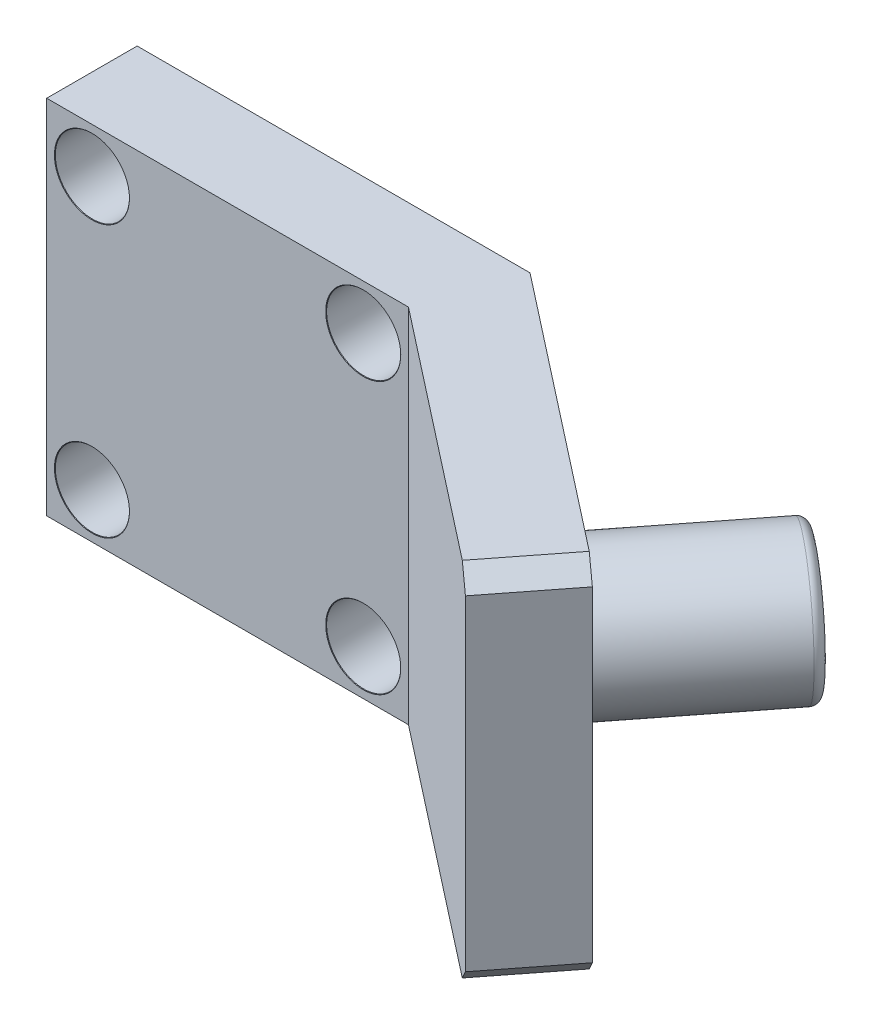
ISO-10303-21;
HEADER;
FILE_DESCRIPTION(('STEP AP214'),'2;1');
FILE_NAME('part.step','',(''),(''),'','','');
FILE_SCHEMA(('AUTOMOTIVE_DESIGN { 1 0 10303 214 1 1 1 1 }'));
ENDSEC;
DATA;
#1=APPLICATION_CONTEXT('core data for automotive mechanical design processes');
#2=APPLICATION_PROTOCOL_DEFINITION('international standard','automotive_design',2000,#1);
#3=PRODUCT_CONTEXT('',#1,'mechanical');
#4=PRODUCT('Part','Part','',(#3));
#5=PRODUCT_RELATED_PRODUCT_CATEGORY('part','',(#4));
#6=PRODUCT_DEFINITION_FORMATION('','',#4);
#7=PRODUCT_DEFINITION_CONTEXT('part definition',#1,'design');
#8=PRODUCT_DEFINITION('design','',#6,#7);
#9=PRODUCT_DEFINITION_SHAPE('','',#8);
#10=(LENGTH_UNIT() NAMED_UNIT(*) SI_UNIT(.MILLI.,.METRE.));
#11=(NAMED_UNIT(*) PLANE_ANGLE_UNIT() SI_UNIT($,.RADIAN.));
#12=(NAMED_UNIT(*) SI_UNIT($,.STERADIAN.) SOLID_ANGLE_UNIT());
#13=UNCERTAINTY_MEASURE_WITH_UNIT(LENGTH_MEASURE(1.E-05),#10,'distance_accuracy_value','');
#14=(GEOMETRIC_REPRESENTATION_CONTEXT(3) GLOBAL_UNCERTAINTY_ASSIGNED_CONTEXT((#13)) GLOBAL_UNIT_ASSIGNED_CONTEXT((#10,
#11,#12)) REPRESENTATION_CONTEXT('',''));
#15=CARTESIAN_POINT('',(0.,0.,0.));
#16=DIRECTION('',(0.,0.,1.));
#17=DIRECTION('',(1.,0.,0.));
#18=AXIS2_PLACEMENT_3D('',#15,#16,#17);
#19=CARTESIAN_POINT('',(0.,10.,0.));
#20=DIRECTION('',(-0.615661475325653,0.,0.788010753606726));
#21=DIRECTION('',(0.788010753606726,0.,0.615661475325653));
#22=AXIS2_PLACEMENT_3D('',#19,#20,#21);
#23=PLANE('',#22);
#24=CARTESIAN_POINT('',(7.88010753606726,0.,6.15661475325653));
#25=DIRECTION('',(-0.615661475325653,0.,0.788010753606726));
#26=DIRECTION('',(0.788010753606726,0.,0.615661475325653));
#27=AXIS2_PLACEMENT_3D('',#24,#25,#26);
#28=CIRCLE('',#27,3.75);
#29=CARTESIAN_POINT('',(10.8351478620925,0.,8.46534528572773));
#30=VERTEX_POINT('',#29);
#31=EDGE_CURVE('E136',#30,#30,#28,.F.);
#32=ORIENTED_EDGE('',*,*,#31,.F.);
#33=EDGE_LOOP('',(#32));
#34=FACE_BOUND('',#33,.T.);
#35=DIRECTION('',(0.,-1.,0.));
#36=VECTOR('',#35,1.);
#37=CARTESIAN_POINT('',(15.7602150721345,10.,12.3132295065131));
#38=LINE('',#37,#36);
#39=CARTESIAN_POINT('',(15.7602150721345,9.,12.3132295065131));
#40=VERTEX_POINT('',#39);
#41=CARTESIAN_POINT('',(15.7602150721345,-8.99999999999999,12.3132295065131));
#42=VERTEX_POINT('',#41);
#43=EDGE_CURVE('E184',#40,#42,#38,.T.);
#44=ORIENTED_EDGE('',*,*,#43,.T.);
#45=DIRECTION('',(-0.557207747523238,-0.707106781186547,-0.435338404118084));
#46=VECTOR('',#45,1.);
#47=CARTESIAN_POINT('',(15.7602150721345,-8.99999999999999,12.3132295065131));
#48=LINE('',#47,#46);
#49=CARTESIAN_POINT('',(14.9722043185278,-10.,11.6975680311874));
#50=VERTEX_POINT('',#49);
#51=EDGE_CURVE('E164',#42,#50,#48,.T.);
#52=ORIENTED_EDGE('',*,*,#51,.T.);
#53=DIRECTION('',(-0.788010753606726,0.,-0.615661475325653));
#54=VECTOR('',#53,1.);
#55=CARTESIAN_POINT('',(0.,-10.,0.));
#56=LINE('',#55,#54);
#57=CARTESIAN_POINT('',(0.,-10.,0.));
#58=VERTEX_POINT('',#57);
#59=EDGE_CURVE('E133',#50,#58,#56,.T.);
#60=ORIENTED_EDGE('',*,*,#59,.T.);
#61=DIRECTION('',(0.,-1.,0.));
#62=VECTOR('',#61,1.);
#63=CARTESIAN_POINT('',(0.,10.,0.));
#64=LINE('',#63,#62);
#65=CARTESIAN_POINT('',(0.,10.,0.));
#66=VERTEX_POINT('',#65);
#67=EDGE_CURVE('E125',#66,#58,#64,.T.);
#68=ORIENTED_EDGE('',*,*,#67,.F.);
#69=DIRECTION('',(-0.788010753606726,0.,-0.615661475325653));
#70=VECTOR('',#69,1.);
#71=CARTESIAN_POINT('',(0.,10.,0.));
#72=LINE('',#71,#70);
#73=CARTESIAN_POINT('',(14.9722043185278,10.,11.6975680311874));
#74=VERTEX_POINT('',#73);
#75=EDGE_CURVE('E111',#74,#66,#72,.T.);
#76=ORIENTED_EDGE('',*,*,#75,.F.);
#77=DIRECTION('',(-0.557207747523235,0.707106781186551,-0.435338404118082));
#78=VECTOR('',#77,1.);
#79=CARTESIAN_POINT('',(14.9722043185278,10.,11.6975680311874));
#80=LINE('',#79,#78);
#81=EDGE_CURVE('E161',#74,#40,#80,.F.);
#82=ORIENTED_EDGE('',*,*,#81,.T.);
#83=EDGE_LOOP('',(#44,#52,#60,#68,#76,#82));
#84=FACE_BOUND('',#83,.T.);
#85=ADVANCED_FACE('F41',(#34,#84),#23,.F.);
#86=CARTESIAN_POINT('',(0.,10.,0.));
#87=DIRECTION('',(0.,0.,1.));
#88=DIRECTION('',(1.,0.,0.));
#89=AXIS2_PLACEMENT_3D('',#86,#87,#88);
#90=PLANE('',#89);
#91=CARTESIAN_POINT('',(-19.2216380664483,7.5,0.));
#92=DIRECTION('',(0.,0.,1.));
#93=DIRECTION('',(1.,0.,0.));
#94=AXIS2_PLACEMENT_3D('',#91,#92,#93);
#95=CIRCLE('',#94,2.05);
#96=CARTESIAN_POINT('',(-17.1716380664483,7.5,0.));
#97=VERTEX_POINT('',#96);
#98=EDGE_CURVE('E260',#97,#97,#95,.T.);
#99=ORIENTED_EDGE('',*,*,#98,.T.);
#100=EDGE_LOOP('',(#99));
#101=FACE_BOUND('',#100,.T.);
#102=CARTESIAN_POINT('',(-4.22163806644831,7.5,0.));
#103=DIRECTION('',(0.,0.,1.));
#104=DIRECTION('',(1.,0.,0.));
#105=AXIS2_PLACEMENT_3D('',#102,#103,#104);
#106=CIRCLE('',#105,2.05);
#107=CARTESIAN_POINT('',(-2.17163806644831,7.5,0.));
#108=VERTEX_POINT('',#107);
#109=EDGE_CURVE('E248',#108,#108,#106,.T.);
#110=ORIENTED_EDGE('',*,*,#109,.T.);
#111=EDGE_LOOP('',(#110));
#112=FACE_BOUND('',#111,.T.);
#113=CARTESIAN_POINT('',(-4.22163806644831,-7.5,0.));
#114=DIRECTION('',(0.,0.,1.));
#115=DIRECTION('',(1.,0.,0.));
#116=AXIS2_PLACEMENT_3D('',#113,#114,#115);
#117=CIRCLE('',#116,2.05);
#118=CARTESIAN_POINT('',(-2.17163806644831,-7.5,0.));
#119=VERTEX_POINT('',#118);
#120=EDGE_CURVE('E236',#119,#119,#117,.T.);
#121=ORIENTED_EDGE('',*,*,#120,.T.);
#122=EDGE_LOOP('',(#121));
#123=FACE_BOUND('',#122,.T.);
#124=CARTESIAN_POINT('',(-19.2216380664483,-7.5,0.));
#125=DIRECTION('',(0.,0.,1.));
#126=DIRECTION('',(1.,0.,0.));
#127=AXIS2_PLACEMENT_3D('',#124,#125,#126);
#128=CIRCLE('',#127,2.05);
#129=CARTESIAN_POINT('',(-17.1716380664483,-7.5,0.));
#130=VERTEX_POINT('',#129);
#131=EDGE_CURVE('E191',#130,#130,#128,.T.);
#132=ORIENTED_EDGE('',*,*,#131,.T.);
#133=EDGE_LOOP('',(#132));
#134=FACE_BOUND('',#133,.T.);
#135=DIRECTION('',(-1.,0.,0.));
#136=VECTOR('',#135,1.);
#137=CARTESIAN_POINT('',(0.,-10.,0.));
#138=LINE('',#137,#136);
#139=CARTESIAN_POINT('',(-21.7216380664483,-10.,0.));
#140=VERTEX_POINT('',#139);
#141=EDGE_CURVE('E189',#58,#140,#138,.T.);
#142=ORIENTED_EDGE('',*,*,#141,.T.);
#143=DIRECTION('',(0.,-1.,0.));
#144=VECTOR('',#143,1.);
#145=CARTESIAN_POINT('',(-21.7216380664483,10.,0.));
#146=LINE('',#145,#144);
#147=CARTESIAN_POINT('',(-21.7216380664483,10.,0.));
#148=VERTEX_POINT('',#147);
#149=EDGE_CURVE('E127',#148,#140,#146,.T.);
#150=ORIENTED_EDGE('',*,*,#149,.F.);
#151=DIRECTION('',(-1.,0.,0.));
#152=VECTOR('',#151,1.);
#153=CARTESIAN_POINT('',(0.,10.,0.));
#154=LINE('',#153,#152);
#155=EDGE_CURVE('E114',#66,#148,#154,.T.);
#156=ORIENTED_EDGE('',*,*,#155,.F.);
#157=ORIENTED_EDGE('',*,*,#67,.T.);
#158=EDGE_LOOP('',(#142,#150,#156,#157));
#159=FACE_BOUND('',#158,.T.);
#160=ADVANCED_FACE('F124',(#101,#112,#123,#134,#159),#90,.F.);
#161=CARTESIAN_POINT('',(-21.7216380664483,10.,0.));
#162=DIRECTION('',(1.,0.,0.));
#163=DIRECTION('',(0.,0.,-1.));
#164=AXIS2_PLACEMENT_3D('',#161,#162,#163);
#165=PLANE('',#164);
#166=DIRECTION('',(0.,0.,1.));
#167=VECTOR('',#166,1.);
#168=CARTESIAN_POINT('',(-21.7216380664483,-10.,0.));
#169=LINE('',#168,#167);
#170=CARTESIAN_POINT('',(-21.7216380664483,-10.,5.));
#171=VERTEX_POINT('',#170);
#172=EDGE_CURVE('E195',#140,#171,#169,.T.);
#173=ORIENTED_EDGE('',*,*,#172,.T.);
#174=DIRECTION('',(0.,-1.,0.));
#175=VECTOR('',#174,1.);
#176=CARTESIAN_POINT('',(-21.7216380664483,10.,5.));
#177=LINE('',#176,#175);
#178=CARTESIAN_POINT('',(-21.7216380664483,10.,5.));
#179=VERTEX_POINT('',#178);
#180=EDGE_CURVE('E143',#179,#171,#177,.T.);
#181=ORIENTED_EDGE('',*,*,#180,.F.);
#182=DIRECTION('',(0.,0.,1.));
#183=VECTOR('',#182,1.);
#184=CARTESIAN_POINT('',(-21.7216380664483,10.,0.));
#185=LINE('',#184,#183);
#186=EDGE_CURVE('E130',#148,#179,#185,.T.);
#187=ORIENTED_EDGE('',*,*,#186,.F.);
#188=ORIENTED_EDGE('',*,*,#149,.T.);
#189=EDGE_LOOP('',(#173,#181,#187,#188));
#190=FACE_BOUND('',#189,.T.);
#191=ADVANCED_FACE('F224',(#190),#165,.F.);
#192=CARTESIAN_POINT('',(-21.7216380664483,10.,5.));
#193=DIRECTION('',(0.,0.,-1.));
#194=DIRECTION('',(-1.,0.,0.));
#195=AXIS2_PLACEMENT_3D('',#192,#193,#194);
#196=PLANE('',#195);
#197=CARTESIAN_POINT('',(-19.2216380664483,7.5,5.));
#198=DIRECTION('',(0.,0.,1.));
#199=DIRECTION('',(1.,0.,0.));
#200=AXIS2_PLACEMENT_3D('',#197,#198,#199);
#201=CIRCLE('',#200,2.075);
#202=CARTESIAN_POINT('',(-17.1466380664483,7.5,5.));
#203=VERTEX_POINT('',#202);
#204=EDGE_CURVE('E268',#203,#203,#201,.T.);
#205=ORIENTED_EDGE('',*,*,#204,.F.);
#206=EDGE_LOOP('',(#205));
#207=FACE_BOUND('',#206,.T.);
#208=CARTESIAN_POINT('',(-4.22163806644831,7.5,5.));
#209=DIRECTION('',(0.,0.,1.));
#210=DIRECTION('',(1.,0.,0.));
#211=AXIS2_PLACEMENT_3D('',#208,#209,#210);
#212=CIRCLE('',#211,2.075);
#213=CARTESIAN_POINT('',(-2.14663806644831,7.5,5.));
#214=VERTEX_POINT('',#213);
#215=EDGE_CURVE('E256',#214,#214,#212,.T.);
#216=ORIENTED_EDGE('',*,*,#215,.F.);
#217=EDGE_LOOP('',(#216));
#218=FACE_BOUND('',#217,.T.);
#219=CARTESIAN_POINT('',(-4.22163806644831,-7.5,5.));
#220=DIRECTION('',(0.,0.,1.));
#221=DIRECTION('',(1.,0.,0.));
#222=AXIS2_PLACEMENT_3D('',#219,#220,#221);
#223=CIRCLE('',#222,2.075);
#224=CARTESIAN_POINT('',(-2.14663806644831,-7.5,5.));
#225=VERTEX_POINT('',#224);
#226=EDGE_CURVE('E244',#225,#225,#223,.T.);
#227=ORIENTED_EDGE('',*,*,#226,.F.);
#228=EDGE_LOOP('',(#227));
#229=FACE_BOUND('',#228,.T.);
#230=CARTESIAN_POINT('',(-19.2216380664483,-7.5,5.));
#231=DIRECTION('',(0.,0.,1.));
#232=DIRECTION('',(1.,0.,0.));
#233=AXIS2_PLACEMENT_3D('',#230,#231,#232);
#234=CIRCLE('',#233,2.075);
#235=CARTESIAN_POINT('',(-17.1466380664483,-7.5,5.));
#236=VERTEX_POINT('',#235);
#237=EDGE_CURVE('E232',#236,#236,#234,.T.);
#238=ORIENTED_EDGE('',*,*,#237,.F.);
#239=EDGE_LOOP('',(#238));
#240=FACE_BOUND('',#239,.T.);
#241=DIRECTION('',(1.,0.,0.));
#242=VECTOR('',#241,1.);
#243=CARTESIAN_POINT('',(-21.7216380664483,-10.,5.));
#244=LINE('',#243,#242);
#245=CARTESIAN_POINT('',(-1.72163806644831,-10.,5.));
#246=VERTEX_POINT('',#245);
#247=EDGE_CURVE('E206',#171,#246,#244,.T.);
#248=ORIENTED_EDGE('',*,*,#247,.T.);
#249=DIRECTION('',(0.,-1.,0.));
#250=VECTOR('',#249,1.);
#251=CARTESIAN_POINT('',(-1.72163806644831,10.,5.));
#252=LINE('',#251,#250);
#253=CARTESIAN_POINT('',(-1.72163806644831,10.,5.));
#254=VERTEX_POINT('',#253);
#255=EDGE_CURVE('E183',#254,#246,#252,.T.);
#256=ORIENTED_EDGE('',*,*,#255,.F.);
#257=DIRECTION('',(1.,0.,0.));
#258=VECTOR('',#257,1.);
#259=CARTESIAN_POINT('',(-21.7216380664483,10.,5.));
#260=LINE('',#259,#258);
#261=EDGE_CURVE('E222',#179,#254,#260,.T.);
#262=ORIENTED_EDGE('',*,*,#261,.F.);
#263=ORIENTED_EDGE('',*,*,#180,.T.);
#264=EDGE_LOOP('',(#248,#256,#262,#263));
#265=FACE_BOUND('',#264,.T.);
#266=ADVANCED_FACE('F220',(#207,#218,#229,#240,#265),#196,.F.);
#267=CARTESIAN_POINT('',(-1.72163806644831,10.,5.));
#268=DIRECTION('',(0.615661475325653,0.,-0.788010753606726));
#269=DIRECTION('',(-0.788010753606726,0.,-0.615661475325653));
#270=AXIS2_PLACEMENT_3D('',#267,#268,#269);
#271=PLANE('',#270);
#272=DIRECTION('',(0.788010753606726,0.,0.615661475325653));
#273=VECTOR('',#272,1.);
#274=CARTESIAN_POINT('',(-1.72163806644831,-10.,5.));
#275=LINE('',#274,#273);
#276=CARTESIAN_POINT('',(11.8938969418995,-10.,15.637621799221));
#277=VERTEX_POINT('',#276);
#278=EDGE_CURVE('E120',#246,#277,#275,.T.);
#279=ORIENTED_EDGE('',*,*,#278,.T.);
#280=DIRECTION('',(0.557207747523238,0.707106781186547,0.435338404118084));
#281=VECTOR('',#280,1.);
#282=CARTESIAN_POINT('',(12.6819076955062,-8.99999999999999,16.2532832745467));
#283=LINE('',#282,#281);
#284=CARTESIAN_POINT('',(12.6819076955062,-8.99999999999999,16.2532832745467));
#285=VERTEX_POINT('',#284);
#286=EDGE_CURVE('E51',#277,#285,#283,.T.);
#287=ORIENTED_EDGE('',*,*,#286,.T.);
#288=DIRECTION('',(0.,-1.,0.));
#289=VECTOR('',#288,1.);
#290=CARTESIAN_POINT('',(12.6819076955062,10.,16.2532832745467));
#291=LINE('',#290,#289);
#292=CARTESIAN_POINT('',(12.6819076955062,9.,16.2532832745467));
#293=VERTEX_POINT('',#292);
#294=EDGE_CURVE('E174',#293,#285,#291,.T.);
#295=ORIENTED_EDGE('',*,*,#294,.F.);
#296=DIRECTION('',(0.557207747523235,-0.707106781186551,0.435338404118082));
#297=VECTOR('',#296,1.);
#298=CARTESIAN_POINT('',(11.8938969418995,10.,15.6376217992211));
#299=LINE('',#298,#297);
#300=CARTESIAN_POINT('',(11.8938969418995,10.,15.637621799221));
#301=VERTEX_POINT('',#300);
#302=EDGE_CURVE('E58',#293,#301,#299,.F.);
#303=ORIENTED_EDGE('',*,*,#302,.T.);
#304=DIRECTION('',(0.788010753606726,0.,0.615661475325653));
#305=VECTOR('',#304,1.);
#306=CARTESIAN_POINT('',(-1.72163806644831,10.,5.));
#307=LINE('',#306,#305);
#308=EDGE_CURVE('E201',#254,#301,#307,.T.);
#309=ORIENTED_EDGE('',*,*,#308,.F.);
#310=ORIENTED_EDGE('',*,*,#255,.T.);
#311=EDGE_LOOP('',(#279,#287,#295,#303,#309,#310));
#312=FACE_BOUND('',#311,.T.);
#313=ADVANCED_FACE('F173',(#312),#271,.F.);
#314=CARTESIAN_POINT('',(15.7602150721345,10.,12.3132295065131));
#315=DIRECTION('',(-0.788010753606726,0.,-0.615661475325653));
#316=DIRECTION('',(-0.615661475325653,0.,0.788010753606726));
#317=AXIS2_PLACEMENT_3D('',#314,#315,#316);
#318=PLANE('',#317);
#319=ORIENTED_EDGE('',*,*,#294,.T.);
#320=DIRECTION('',(0.615661475325653,0.,-0.788010753606726));
#321=VECTOR('',#320,1.);
#322=CARTESIAN_POINT('',(15.7602150721345,-8.99999999999999,12.3132295065131));
#323=LINE('',#322,#321);
#324=EDGE_CURVE('E157',#285,#42,#323,.T.);
#325=ORIENTED_EDGE('',*,*,#324,.T.);
#326=ORIENTED_EDGE('',*,*,#43,.F.);
#327=DIRECTION('',(-0.615661475325653,0.,0.788010753606726));
#328=VECTOR('',#327,1.);
#329=CARTESIAN_POINT('',(15.7602150721345,9.,12.3132295065131));
#330=LINE('',#329,#328);
#331=EDGE_CURVE('E154',#40,#293,#330,.T.);
#332=ORIENTED_EDGE('',*,*,#331,.T.);
#333=EDGE_LOOP('',(#319,#325,#326,#332));
#334=FACE_BOUND('',#333,.T.);
#335=ADVANCED_FACE('F179',(#334),#318,.F.);
#336=CARTESIAN_POINT('',(0.,10.,0.));
#337=DIRECTION('',(0.,-1.,0.));
#338=DIRECTION('',(0.,0.,-1.));
#339=AXIS2_PLACEMENT_3D('',#336,#337,#338);
#340=PLANE('',#339);
#341=ORIENTED_EDGE('',*,*,#308,.T.);
#342=DIRECTION('',(0.615661475325653,0.,-0.788010753606726));
#343=VECTOR('',#342,1.);
#344=CARTESIAN_POINT('',(14.9722043185278,10.,11.6975680311874));
#345=LINE('',#344,#343);
#346=EDGE_CURVE('E11',#301,#74,#345,.T.);
#347=ORIENTED_EDGE('',*,*,#346,.T.);
#348=ORIENTED_EDGE('',*,*,#75,.T.);
#349=ORIENTED_EDGE('',*,*,#155,.T.);
#350=ORIENTED_EDGE('',*,*,#186,.T.);
#351=ORIENTED_EDGE('',*,*,#261,.T.);
#352=EDGE_LOOP('',(#341,#347,#348,#349,#350,#351));
#353=FACE_BOUND('',#352,.T.);
#354=ADVANCED_FACE('F113',(#353),#340,.F.);
#355=CARTESIAN_POINT('',(0.,-10.,0.));
#356=DIRECTION('',(0.,-1.,0.));
#357=DIRECTION('',(0.,0.,-1.));
#358=AXIS2_PLACEMENT_3D('',#355,#356,#357);
#359=PLANE('',#358);
#360=ORIENTED_EDGE('',*,*,#59,.F.);
#361=DIRECTION('',(-0.615661475325653,0.,0.788010753606726));
#362=VECTOR('',#361,1.);
#363=CARTESIAN_POINT('',(11.8938969418995,-10.,15.637621799221));
#364=LINE('',#363,#362);
#365=EDGE_CURVE('E66',#50,#277,#364,.T.);
#366=ORIENTED_EDGE('',*,*,#365,.T.);
#367=ORIENTED_EDGE('',*,*,#278,.F.);
#368=ORIENTED_EDGE('',*,*,#247,.F.);
#369=ORIENTED_EDGE('',*,*,#172,.F.);
#370=ORIENTED_EDGE('',*,*,#141,.F.);
#371=EDGE_LOOP('',(#360,#366,#367,#368,#369,#370));
#372=FACE_BOUND('',#371,.T.);
#373=ADVANCED_FACE('F187',(#372),#359,.T.);
#374=CARTESIAN_POINT('',(-19.2216380664483,-7.5,5.));
#375=DIRECTION('',(0.,0.,1.));
#376=DIRECTION('',(1.,0.,0.));
#377=AXIS2_PLACEMENT_3D('',#374,#375,#376);
#378=CYLINDRICAL_SURFACE('',#377,2.05);
#379=ORIENTED_EDGE('',*,*,#131,.F.);
#380=EDGE_LOOP('',(#379));
#381=FACE_BOUND('',#380,.T.);
#382=CARTESIAN_POINT('',(-19.2216380664483,-7.5,4.975));
#383=DIRECTION('',(0.,0.,1.));
#384=DIRECTION('',(1.,0.,0.));
#385=AXIS2_PLACEMENT_3D('',#382,#383,#384);
#386=CIRCLE('',#385,2.05);
#387=CARTESIAN_POINT('',(-17.1716380664483,-7.5,4.975));
#388=VERTEX_POINT('',#387);
#389=EDGE_CURVE('E198',#388,#388,#386,.T.);
#390=ORIENTED_EDGE('',*,*,#389,.T.);
#391=EDGE_LOOP('',(#390));
#392=FACE_BOUND('',#391,.T.);
#393=ADVANCED_FACE('F287',(#381,#392),#378,.F.);
#394=CARTESIAN_POINT('',(-19.2216380664483,-7.5,5.));
#395=DIRECTION('',(0.,0.,1.));
#396=DIRECTION('',(1.,0.,0.));
#397=AXIS2_PLACEMENT_3D('',#394,#395,#396);
#398=CONICAL_SURFACE('',#397,2.075,0.7853981633975);
#399=ORIENTED_EDGE('',*,*,#389,.F.);
#400=EDGE_LOOP('',(#399));
#401=FACE_BOUND('',#400,.T.);
#402=ORIENTED_EDGE('',*,*,#237,.T.);
#403=EDGE_LOOP('',(#402));
#404=FACE_BOUND('',#403,.T.);
#405=ADVANCED_FACE('F284',(#401,#404),#398,.F.);
#406=CARTESIAN_POINT('',(-4.22163806644831,-7.5,5.));
#407=DIRECTION('',(0.,0.,1.));
#408=DIRECTION('',(1.,0.,0.));
#409=AXIS2_PLACEMENT_3D('',#406,#407,#408);
#410=CYLINDRICAL_SURFACE('',#409,2.05);
#411=ORIENTED_EDGE('',*,*,#120,.F.);
#412=EDGE_LOOP('',(#411));
#413=FACE_BOUND('',#412,.T.);
#414=CARTESIAN_POINT('',(-4.22163806644831,-7.5,4.975));
#415=DIRECTION('',(0.,0.,1.));
#416=DIRECTION('',(1.,0.,0.));
#417=AXIS2_PLACEMENT_3D('',#414,#415,#416);
#418=CIRCLE('',#417,2.05);
#419=CARTESIAN_POINT('',(-2.17163806644831,-7.5,4.975));
#420=VERTEX_POINT('',#419);
#421=EDGE_CURVE('E240',#420,#420,#418,.T.);
#422=ORIENTED_EDGE('',*,*,#421,.T.);
#423=EDGE_LOOP('',(#422));
#424=FACE_BOUND('',#423,.T.);
#425=ADVANCED_FACE('F286',(#413,#424),#410,.F.);
#426=CARTESIAN_POINT('',(-4.22163806644831,-7.5,5.));
#427=DIRECTION('',(0.,0.,1.));
#428=DIRECTION('',(1.,0.,0.));
#429=AXIS2_PLACEMENT_3D('',#426,#427,#428);
#430=CONICAL_SURFACE('',#429,2.075,0.7853981633975);
#431=ORIENTED_EDGE('',*,*,#421,.F.);
#432=EDGE_LOOP('',(#431));
#433=FACE_BOUND('',#432,.T.);
#434=ORIENTED_EDGE('',*,*,#226,.T.);
#435=EDGE_LOOP('',(#434));
#436=FACE_BOUND('',#435,.T.);
#437=ADVANCED_FACE('F294',(#433,#436),#430,.F.);
#438=CARTESIAN_POINT('',(-4.22163806644831,7.5,5.));
#439=DIRECTION('',(0.,0.,1.));
#440=DIRECTION('',(1.,0.,0.));
#441=AXIS2_PLACEMENT_3D('',#438,#439,#440);
#442=CYLINDRICAL_SURFACE('',#441,2.05);
#443=ORIENTED_EDGE('',*,*,#109,.F.);
#444=EDGE_LOOP('',(#443));
#445=FACE_BOUND('',#444,.T.);
#446=CARTESIAN_POINT('',(-4.22163806644831,7.5,4.975));
#447=DIRECTION('',(0.,0.,1.));
#448=DIRECTION('',(1.,0.,0.));
#449=AXIS2_PLACEMENT_3D('',#446,#447,#448);
#450=CIRCLE('',#449,2.05);
#451=CARTESIAN_POINT('',(-2.17163806644831,7.5,4.975));
#452=VERTEX_POINT('',#451);
#453=EDGE_CURVE('E252',#452,#452,#450,.T.);
#454=ORIENTED_EDGE('',*,*,#453,.T.);
#455=EDGE_LOOP('',(#454));
#456=FACE_BOUND('',#455,.T.);
#457=ADVANCED_FACE('F422',(#445,#456),#442,.F.);
#458=CARTESIAN_POINT('',(-4.22163806644831,7.5,5.));
#459=DIRECTION('',(0.,0.,1.));
#460=DIRECTION('',(1.,0.,0.));
#461=AXIS2_PLACEMENT_3D('',#458,#459,#460);
#462=CONICAL_SURFACE('',#461,2.075,0.7853981633975);
#463=ORIENTED_EDGE('',*,*,#453,.F.);
#464=EDGE_LOOP('',(#463));
#465=FACE_BOUND('',#464,.T.);
#466=ORIENTED_EDGE('',*,*,#215,.T.);
#467=EDGE_LOOP('',(#466));
#468=FACE_BOUND('',#467,.T.);
#469=ADVANCED_FACE('F412',(#465,#468),#462,.F.);
#470=CARTESIAN_POINT('',(-19.2216380664483,7.5,5.));
#471=DIRECTION('',(0.,0.,1.));
#472=DIRECTION('',(1.,0.,0.));
#473=AXIS2_PLACEMENT_3D('',#470,#471,#472);
#474=CYLINDRICAL_SURFACE('',#473,2.05);
#475=ORIENTED_EDGE('',*,*,#98,.F.);
#476=EDGE_LOOP('',(#475));
#477=FACE_BOUND('',#476,.T.);
#478=CARTESIAN_POINT('',(-19.2216380664483,7.5,4.975));
#479=DIRECTION('',(0.,0.,1.));
#480=DIRECTION('',(1.,0.,0.));
#481=AXIS2_PLACEMENT_3D('',#478,#479,#480);
#482=CIRCLE('',#481,2.05);
#483=CARTESIAN_POINT('',(-17.1716380664483,7.5,4.975));
#484=VERTEX_POINT('',#483);
#485=EDGE_CURVE('E264',#484,#484,#482,.T.);
#486=ORIENTED_EDGE('',*,*,#485,.T.);
#487=EDGE_LOOP('',(#486));
#488=FACE_BOUND('',#487,.T.);
#489=ADVANCED_FACE('F402',(#477,#488),#474,.F.);
#490=CARTESIAN_POINT('',(-19.2216380664483,7.5,5.));
#491=DIRECTION('',(0.,0.,1.));
#492=DIRECTION('',(1.,0.,0.));
#493=AXIS2_PLACEMENT_3D('',#490,#491,#492);
#494=CONICAL_SURFACE('',#493,2.075,0.7853981633975);
#495=ORIENTED_EDGE('',*,*,#485,.F.);
#496=EDGE_LOOP('',(#495));
#497=FACE_BOUND('',#496,.T.);
#498=ORIENTED_EDGE('',*,*,#204,.T.);
#499=EDGE_LOOP('',(#498));
#500=FACE_BOUND('',#499,.T.);
#501=ADVANCED_FACE('F273',(#497,#500),#494,.F.);
#502=CARTESIAN_POINT('',(14.0367222893238,0.,-1.72349278281072));
#503=DIRECTION('',(-0.615661475325653,0.,0.788010753606726));
#504=DIRECTION('',(0.788010753606726,0.,0.615661475325653));
#505=AXIS2_PLACEMENT_3D('',#502,#503,#504);
#506=CYLINDRICAL_SURFACE('',#505,3.75);
#507=CARTESIAN_POINT('',(13.728891551661,0.,-1.32948740600736));
#508=DIRECTION('',(0.615661475325653,0.,-0.788010753606726));
#509=DIRECTION('',(-0.788010753606726,0.,-0.615661475325653));
#510=AXIS2_PLACEMENT_3D('',#507,#508,#509);
#511=CIRCLE('',#510,3.75);
#512=CARTESIAN_POINT('',(10.7738512256357,0.,-3.63821793847856));
#513=VERTEX_POINT('',#512);
#514=EDGE_CURVE('E150',#513,#513,#511,.F.);
#515=ORIENTED_EDGE('',*,*,#514,.T.);
#516=EDGE_LOOP('',(#515));
#517=FACE_BOUND('',#516,.T.);
#518=ORIENTED_EDGE('',*,*,#31,.T.);
#519=EDGE_LOOP('',(#518));
#520=FACE_BOUND('',#519,.T.);
#521=ADVANCED_FACE('F383',(#517,#520),#506,.T.);
#522=CARTESIAN_POINT('',(14.0367222893238,0.,-1.72349278281072));
#523=DIRECTION('',(0.615661475325653,0.,-0.788010753606726));
#524=DIRECTION('',(-0.788010753606726,0.,-0.615661475325653));
#525=AXIS2_PLACEMENT_3D('',#522,#523,#524);
#526=PLANE('',#525);
#527=CARTESIAN_POINT('',(14.0367222893238,0.,-1.72349278281072));
#528=DIRECTION('',(0.615661475325653,0.,-0.788010753606726));
#529=DIRECTION('',(-0.788010753606726,0.,-0.615661475325653));
#530=AXIS2_PLACEMENT_3D('',#527,#528,#529);
#531=CIRCLE('',#530,3.25);
#532=CARTESIAN_POINT('',(11.4756873401019,0.,-3.7243925776191));
#533=VERTEX_POINT('',#532);
#534=EDGE_CURVE('E141',#533,#533,#531,.T.);
#535=ORIENTED_EDGE('',*,*,#534,.T.);
#536=EDGE_LOOP('',(#535));
#537=FACE_BOUND('',#536,.T.);
#538=ADVANCED_FACE('F313',(#537),#526,.T.);
#539=CARTESIAN_POINT('',(13.728891551661,0.,-1.32948740600736));
#540=DIRECTION('',(0.615661475325653,0.,-0.788010753606726));
#541=DIRECTION('',(-0.788010753606726,0.,-0.615661475325653));
#542=AXIS2_PLACEMENT_3D('',#539,#540,#541);
#543=TOROIDAL_SURFACE('',#542,3.25,0.5);
#544=ORIENTED_EDGE('',*,*,#514,.F.);
#545=EDGE_LOOP('',(#544));
#546=FACE_BOUND('',#545,.T.);
#547=ORIENTED_EDGE('',*,*,#534,.F.);
#548=EDGE_LOOP('',(#547));
#549=FACE_BOUND('',#548,.T.);
#550=ADVANCED_FACE('F311',(#546,#549),#543,.T.);
#551=CARTESIAN_POINT('',(15.7602150721345,-8.99999999999999,12.3132295065131));
#552=DIRECTION('',(0.557207747523238,-0.707106781186548,0.435338404118084));
#553=DIRECTION('',(-0.615661475325653,0.,0.788010753606726));
#554=AXIS2_PLACEMENT_3D('',#551,#552,#553);
#555=PLANE('',#554);
#556=ORIENTED_EDGE('',*,*,#286,.F.);
#557=ORIENTED_EDGE('',*,*,#365,.F.);
#558=ORIENTED_EDGE('',*,*,#51,.F.);
#559=ORIENTED_EDGE('',*,*,#324,.F.);
#560=EDGE_LOOP('',(#556,#557,#558,#559));
#561=FACE_BOUND('',#560,.T.);
#562=ADVANCED_FACE('F186',(#561),#555,.T.);
#563=CARTESIAN_POINT('',(14.9722043185278,10.,11.6975680311874));
#564=DIRECTION('',(-0.55720774752324,-0.707106781186544,-0.435338404118085));
#565=DIRECTION('',(0.615661475325653,0.,-0.788010753606726));
#566=AXIS2_PLACEMENT_3D('',#563,#564,#565);
#567=PLANE('',#566);
#568=ORIENTED_EDGE('',*,*,#302,.F.);
#569=ORIENTED_EDGE('',*,*,#331,.F.);
#570=ORIENTED_EDGE('',*,*,#81,.F.);
#571=ORIENTED_EDGE('',*,*,#346,.F.);
#572=EDGE_LOOP('',(#568,#569,#570,#571));
#573=FACE_BOUND('',#572,.T.);
#574=ADVANCED_FACE('F44',(#573),#567,.F.);
#575=CLOSED_SHELL('',(#85,#160,#191,#266,#313,#335,#354,#373,#393,#405,#425,#437,#457,#469,#489,
#501,#521,#538,#550,#562,#574));
#576=MANIFOLD_SOLID_BREP('B2',#575);
#577=ADVANCED_BREP_SHAPE_REPRESENTATION('',(#18,#576),#14);
#578=SHAPE_DEFINITION_REPRESENTATION(#9,#577);
ENDSEC;
END-ISO-10303-21;
